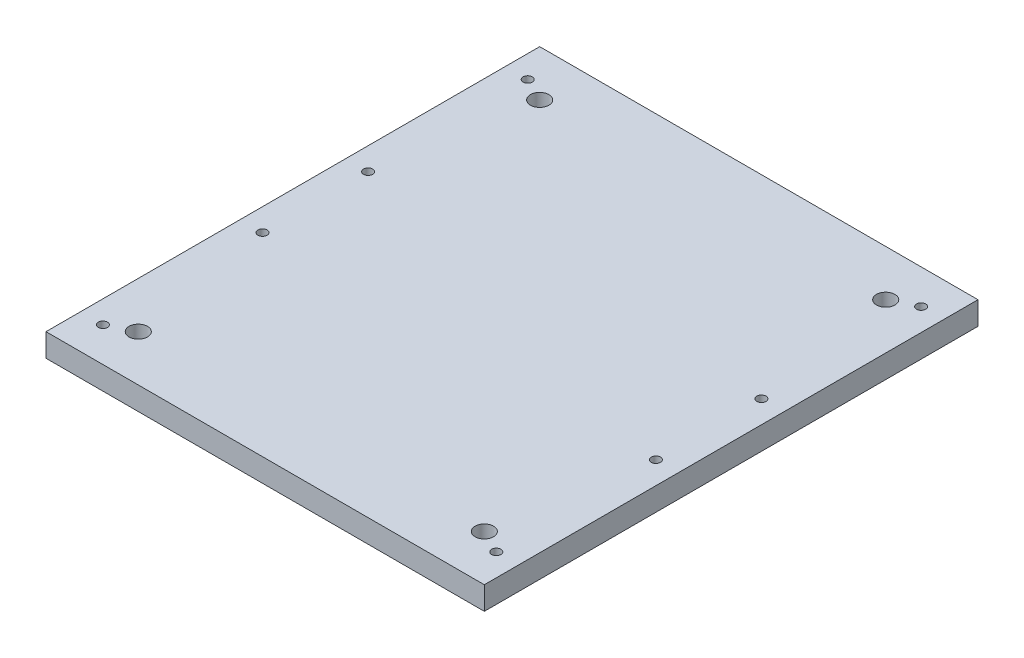
ISO-10303-21;
HEADER;
FILE_DESCRIPTION(('STEP AP214'),'2;1');
FILE_NAME('part.step','',(''),(''),'','','');
FILE_SCHEMA(('AUTOMOTIVE_DESIGN { 1 0 10303 214 1 1 1 1 }'));
ENDSEC;
DATA;
#1=APPLICATION_CONTEXT('core data for automotive mechanical design processes');
#2=APPLICATION_PROTOCOL_DEFINITION('international standard','automotive_design',2000,#1);
#3=PRODUCT_CONTEXT('',#1,'mechanical');
#4=PRODUCT('Part','Part','',(#3));
#5=PRODUCT_RELATED_PRODUCT_CATEGORY('part','',(#4));
#6=PRODUCT_DEFINITION_FORMATION('','',#4);
#7=PRODUCT_DEFINITION_CONTEXT('part definition',#1,'design');
#8=PRODUCT_DEFINITION('design','',#6,#7);
#9=PRODUCT_DEFINITION_SHAPE('','',#8);
#10=(LENGTH_UNIT() NAMED_UNIT(*) SI_UNIT(.MILLI.,.METRE.));
#11=(NAMED_UNIT(*) PLANE_ANGLE_UNIT() SI_UNIT($,.RADIAN.));
#12=(NAMED_UNIT(*) SI_UNIT($,.STERADIAN.) SOLID_ANGLE_UNIT());
#13=UNCERTAINTY_MEASURE_WITH_UNIT(LENGTH_MEASURE(1.E-05),#10,'distance_accuracy_value','');
#14=(GEOMETRIC_REPRESENTATION_CONTEXT(3) GLOBAL_UNCERTAINTY_ASSIGNED_CONTEXT((#13)) GLOBAL_UNIT_ASSIGNED_CONTEXT((#10,
#11,#12)) REPRESENTATION_CONTEXT('',''));
#15=CARTESIAN_POINT('',(0.,0.,0.));
#16=DIRECTION('',(0.,0.,1.));
#17=DIRECTION('',(1.,0.,0.));
#18=AXIS2_PLACEMENT_3D('',#15,#16,#17);
#19=CARTESIAN_POINT('',(0.,5.,53.5));
#20=DIRECTION('',(0.,0.,-1.));
#21=DIRECTION('',(-1.,0.,0.));
#22=AXIS2_PLACEMENT_3D('',#19,#20,#21);
#23=PLANE('',#22);
#24=DIRECTION('',(1.,0.,0.));
#25=VECTOR('',#24,1.);
#26=CARTESIAN_POINT('',(0.,0.,53.5));
#27=LINE('',#26,#25);
#28=CARTESIAN_POINT('',(-47.5,0.,53.5));
#29=VERTEX_POINT('',#28);
#30=CARTESIAN_POINT('',(47.5,0.,53.5));
#31=VERTEX_POINT('',#30);
#32=EDGE_CURVE('E115',#29,#31,#27,.T.);
#33=ORIENTED_EDGE('',*,*,#32,.T.);
#34=DIRECTION('',(0.,-1.,0.));
#35=VECTOR('',#34,1.);
#36=CARTESIAN_POINT('',(47.5,5.,53.5));
#37=LINE('',#36,#35);
#38=CARTESIAN_POINT('',(47.5,5.,53.5));
#39=VERTEX_POINT('',#38);
#40=EDGE_CURVE('E11',#39,#31,#37,.T.);
#41=ORIENTED_EDGE('',*,*,#40,.F.);
#42=DIRECTION('',(1.,0.,0.));
#43=VECTOR('',#42,1.);
#44=CARTESIAN_POINT('',(0.,5.,53.5));
#45=LINE('',#44,#43);
#46=CARTESIAN_POINT('',(-47.5,5.,53.5));
#47=VERTEX_POINT('',#46);
#48=EDGE_CURVE('E89',#47,#39,#45,.T.);
#49=ORIENTED_EDGE('',*,*,#48,.F.);
#50=DIRECTION('',(0.,-1.,0.));
#51=VECTOR('',#50,1.);
#52=CARTESIAN_POINT('',(-47.5,5.,53.5));
#53=LINE('',#52,#51);
#54=EDGE_CURVE('E55',#47,#29,#53,.T.);
#55=ORIENTED_EDGE('',*,*,#54,.T.);
#56=EDGE_LOOP('',(#33,#41,#49,#55));
#57=FACE_BOUND('',#56,.T.);
#58=ADVANCED_FACE('F39',(#57),#23,.F.);
#59=CARTESIAN_POINT('',(47.5,5.,0.));
#60=DIRECTION('',(-1.,0.,0.));
#61=DIRECTION('',(0.,0.,1.));
#62=AXIS2_PLACEMENT_3D('',#59,#60,#61);
#63=PLANE('',#62);
#64=DIRECTION('',(0.,0.,-1.));
#65=VECTOR('',#64,1.);
#66=CARTESIAN_POINT('',(47.5,0.,0.));
#67=LINE('',#66,#65);
#68=CARTESIAN_POINT('',(47.5,0.,-53.5));
#69=VERTEX_POINT('',#68);
#70=EDGE_CURVE('E94',#31,#69,#67,.T.);
#71=ORIENTED_EDGE('',*,*,#70,.T.);
#72=DIRECTION('',(0.,-1.,0.));
#73=VECTOR('',#72,1.);
#74=CARTESIAN_POINT('',(47.5,5.,-53.5));
#75=LINE('',#74,#73);
#76=CARTESIAN_POINT('',(47.5,5.,-53.5));
#77=VERTEX_POINT('',#76);
#78=EDGE_CURVE('E47',#77,#69,#75,.T.);
#79=ORIENTED_EDGE('',*,*,#78,.F.);
#80=DIRECTION('',(0.,0.,-1.));
#81=VECTOR('',#80,1.);
#82=CARTESIAN_POINT('',(47.5,5.,0.));
#83=LINE('',#82,#81);
#84=EDGE_CURVE('E80',#39,#77,#83,.T.);
#85=ORIENTED_EDGE('',*,*,#84,.F.);
#86=ORIENTED_EDGE('',*,*,#40,.T.);
#87=EDGE_LOOP('',(#71,#79,#85,#86));
#88=FACE_BOUND('',#87,.T.);
#89=ADVANCED_FACE('F93',(#88),#63,.F.);
#90=CARTESIAN_POINT('',(0.,5.,-53.5));
#91=DIRECTION('',(0.,0.,-1.));
#92=DIRECTION('',(-1.,0.,0.));
#93=AXIS2_PLACEMENT_3D('',#90,#91,#92);
#94=PLANE('',#93);
#95=DIRECTION('',(1.,0.,0.));
#96=VECTOR('',#95,1.);
#97=CARTESIAN_POINT('',(0.,0.,-53.5));
#98=LINE('',#97,#96);
#99=CARTESIAN_POINT('',(-47.5,0.,-53.5));
#100=VERTEX_POINT('',#99);
#101=EDGE_CURVE('E119',#100,#69,#98,.T.);
#102=ORIENTED_EDGE('',*,*,#101,.F.);
#103=DIRECTION('',(0.,-1.,0.));
#104=VECTOR('',#103,1.);
#105=CARTESIAN_POINT('',(-47.5,5.,-53.5));
#106=LINE('',#105,#104);
#107=CARTESIAN_POINT('',(-47.5,5.,-53.5));
#108=VERTEX_POINT('',#107);
#109=EDGE_CURVE('E69',#108,#100,#106,.T.);
#110=ORIENTED_EDGE('',*,*,#109,.F.);
#111=DIRECTION('',(1.,0.,0.));
#112=VECTOR('',#111,1.);
#113=CARTESIAN_POINT('',(0.,5.,-53.5));
#114=LINE('',#113,#112);
#115=EDGE_CURVE('E88',#108,#77,#114,.T.);
#116=ORIENTED_EDGE('',*,*,#115,.T.);
#117=ORIENTED_EDGE('',*,*,#78,.T.);
#118=EDGE_LOOP('',(#102,#110,#116,#117));
#119=FACE_BOUND('',#118,.T.);
#120=ADVANCED_FACE('F97',(#119),#94,.T.);
#121=CARTESIAN_POINT('',(37.5,5.,43.5));
#122=DIRECTION('',(0.,-1.,0.));
#123=DIRECTION('',(0.,0.,-1.));
#124=AXIS2_PLACEMENT_3D('',#121,#122,#123);
#125=CYLINDRICAL_SURFACE('',#124,2.);
#126=CARTESIAN_POINT('',(37.5,5.,43.5));
#127=DIRECTION('',(0.,1.,0.));
#128=DIRECTION('',(0.,0.,1.));
#129=AXIS2_PLACEMENT_3D('',#126,#127,#128);
#130=CIRCLE('',#129,2.);
#131=CARTESIAN_POINT('',(37.5,5.,45.5));
#132=VERTEX_POINT('',#131);
#133=EDGE_CURVE('E109',#132,#132,#130,.T.);
#134=ORIENTED_EDGE('',*,*,#133,.T.);
#135=EDGE_LOOP('',(#134));
#136=FACE_BOUND('',#135,.T.);
#137=CARTESIAN_POINT('',(37.5,0.,43.5));
#138=DIRECTION('',(0.,1.,0.));
#139=DIRECTION('',(0.,0.,1.));
#140=AXIS2_PLACEMENT_3D('',#137,#138,#139);
#141=CIRCLE('',#140,2.);
#142=CARTESIAN_POINT('',(37.5,0.,45.5));
#143=VERTEX_POINT('',#142);
#144=EDGE_CURVE('E130',#143,#143,#141,.T.);
#145=ORIENTED_EDGE('',*,*,#144,.F.);
#146=EDGE_LOOP('',(#145));
#147=FACE_BOUND('',#146,.T.);
#148=ADVANCED_FACE('F224',(#136,#147),#125,.F.);
#149=CARTESIAN_POINT('',(37.5,5.,-43.5));
#150=DIRECTION('',(0.,-1.,0.));
#151=DIRECTION('',(0.,0.,-1.));
#152=AXIS2_PLACEMENT_3D('',#149,#150,#151);
#153=CYLINDRICAL_SURFACE('',#152,2.);
#154=CARTESIAN_POINT('',(37.5,5.,-43.5));
#155=DIRECTION('',(0.,1.,0.));
#156=DIRECTION('',(0.,0.,1.));
#157=AXIS2_PLACEMENT_3D('',#154,#155,#156);
#158=CIRCLE('',#157,2.);
#159=CARTESIAN_POINT('',(37.5,5.,-41.5));
#160=VERTEX_POINT('',#159);
#161=EDGE_CURVE('E106',#160,#160,#158,.F.);
#162=ORIENTED_EDGE('',*,*,#161,.F.);
#163=EDGE_LOOP('',(#162));
#164=FACE_BOUND('',#163,.T.);
#165=CARTESIAN_POINT('',(37.5,0.,-43.5));
#166=DIRECTION('',(0.,1.,0.));
#167=DIRECTION('',(0.,0.,1.));
#168=AXIS2_PLACEMENT_3D('',#165,#166,#167);
#169=CIRCLE('',#168,2.);
#170=CARTESIAN_POINT('',(37.5,0.,-41.5));
#171=VERTEX_POINT('',#170);
#172=EDGE_CURVE('E127',#171,#171,#169,.F.);
#173=ORIENTED_EDGE('',*,*,#172,.T.);
#174=EDGE_LOOP('',(#173));
#175=FACE_BOUND('',#174,.T.);
#176=ADVANCED_FACE('F226',(#164,#175),#153,.F.);
#177=CARTESIAN_POINT('',(-37.5,5.,-43.5));
#178=DIRECTION('',(0.,-1.,0.));
#179=DIRECTION('',(0.,0.,-1.));
#180=AXIS2_PLACEMENT_3D('',#177,#178,#179);
#181=CYLINDRICAL_SURFACE('',#180,2.);
#182=CARTESIAN_POINT('',(-37.5,5.,-43.5));
#183=DIRECTION('',(0.,1.,0.));
#184=DIRECTION('',(0.,0.,1.));
#185=AXIS2_PLACEMENT_3D('',#182,#183,#184);
#186=CIRCLE('',#185,2.);
#187=CARTESIAN_POINT('',(-37.5,5.,-41.5));
#188=VERTEX_POINT('',#187);
#189=EDGE_CURVE('E100',#188,#188,#186,.T.);
#190=ORIENTED_EDGE('',*,*,#189,.T.);
#191=EDGE_LOOP('',(#190));
#192=FACE_BOUND('',#191,.T.);
#193=CARTESIAN_POINT('',(-37.5,0.,-43.5));
#194=DIRECTION('',(0.,1.,0.));
#195=DIRECTION('',(0.,0.,1.));
#196=AXIS2_PLACEMENT_3D('',#193,#194,#195);
#197=CIRCLE('',#196,2.);
#198=CARTESIAN_POINT('',(-37.5,0.,-41.5));
#199=VERTEX_POINT('',#198);
#200=EDGE_CURVE('E124',#199,#199,#197,.T.);
#201=ORIENTED_EDGE('',*,*,#200,.F.);
#202=EDGE_LOOP('',(#201));
#203=FACE_BOUND('',#202,.T.);
#204=ADVANCED_FACE('F233',(#192,#203),#181,.F.);
#205=CARTESIAN_POINT('',(-47.5,5.,0.));
#206=DIRECTION('',(-1.,0.,0.));
#207=DIRECTION('',(0.,0.,1.));
#208=AXIS2_PLACEMENT_3D('',#205,#206,#207);
#209=PLANE('',#208);
#210=DIRECTION('',(0.,0.,-1.));
#211=VECTOR('',#210,1.);
#212=CARTESIAN_POINT('',(-47.5,0.,0.));
#213=LINE('',#212,#211);
#214=EDGE_CURVE('E121',#29,#100,#213,.T.);
#215=ORIENTED_EDGE('',*,*,#214,.F.);
#216=ORIENTED_EDGE('',*,*,#54,.F.);
#217=DIRECTION('',(0.,0.,-1.));
#218=VECTOR('',#217,1.);
#219=CARTESIAN_POINT('',(-47.5,5.,0.));
#220=LINE('',#219,#218);
#221=EDGE_CURVE('E98',#47,#108,#220,.T.);
#222=ORIENTED_EDGE('',*,*,#221,.T.);
#223=ORIENTED_EDGE('',*,*,#109,.T.);
#224=EDGE_LOOP('',(#215,#216,#222,#223));
#225=FACE_BOUND('',#224,.T.);
#226=ADVANCED_FACE('F242',(#225),#209,.T.);
#227=CARTESIAN_POINT('',(-37.5,5.,43.5));
#228=DIRECTION('',(0.,-1.,0.));
#229=DIRECTION('',(0.,0.,-1.));
#230=AXIS2_PLACEMENT_3D('',#227,#228,#229);
#231=CYLINDRICAL_SURFACE('',#230,2.);
#232=CARTESIAN_POINT('',(-37.5,5.,43.5));
#233=DIRECTION('',(0.,1.,0.));
#234=DIRECTION('',(0.,0.,1.));
#235=AXIS2_PLACEMENT_3D('',#232,#233,#234);
#236=CIRCLE('',#235,2.);
#237=CARTESIAN_POINT('',(-37.5,5.,45.5));
#238=VERTEX_POINT('',#237);
#239=EDGE_CURVE('E112',#238,#238,#236,.F.);
#240=ORIENTED_EDGE('',*,*,#239,.F.);
#241=EDGE_LOOP('',(#240));
#242=FACE_BOUND('',#241,.T.);
#243=CARTESIAN_POINT('',(-37.5,0.,43.5));
#244=DIRECTION('',(0.,1.,0.));
#245=DIRECTION('',(0.,0.,1.));
#246=AXIS2_PLACEMENT_3D('',#243,#244,#245);
#247=CIRCLE('',#246,2.);
#248=CARTESIAN_POINT('',(-37.5,0.,45.5));
#249=VERTEX_POINT('',#248);
#250=EDGE_CURVE('E133',#249,#249,#247,.F.);
#251=ORIENTED_EDGE('',*,*,#250,.T.);
#252=EDGE_LOOP('',(#251));
#253=FACE_BOUND('',#252,.T.);
#254=ADVANCED_FACE('F244',(#242,#253),#231,.F.);
#255=CARTESIAN_POINT('',(0.,5.,0.));
#256=DIRECTION('',(0.,1.,0.));
#257=DIRECTION('',(0.,0.,1.));
#258=AXIS2_PLACEMENT_3D('',#255,#256,#257);
#259=PLANE('',#258);
#260=CARTESIAN_POINT('',(-42.63,5.,11.4372225515875));
#261=DIRECTION('',(0.,-1.,0.));
#262=DIRECTION('',(0.,0.,1.));
#263=AXIS2_PLACEMENT_3D('',#260,#261,#262);
#264=CIRCLE('',#263,0.999999999999998);
#265=CARTESIAN_POINT('',(-42.63,5.,12.4372225515875));
#266=VERTEX_POINT('',#265);
#267=EDGE_CURVE('E181',#266,#266,#264,.T.);
#268=ORIENTED_EDGE('',*,*,#267,.T.);
#269=EDGE_LOOP('',(#268));
#270=FACE_BOUND('',#269,.T.);
#271=CARTESIAN_POINT('',(-42.63,5.,-11.4372225515875));
#272=DIRECTION('',(0.,1.,0.));
#273=DIRECTION('',(0.,0.,-1.));
#274=AXIS2_PLACEMENT_3D('',#271,#272,#273);
#275=CIRCLE('',#274,0.999999999999998);
#276=CARTESIAN_POINT('',(-42.63,5.,-12.4372225515875));
#277=VERTEX_POINT('',#276);
#278=EDGE_CURVE('E178',#277,#277,#275,.T.);
#279=ORIENTED_EDGE('',*,*,#278,.F.);
#280=EDGE_LOOP('',(#279));
#281=FACE_BOUND('',#280,.T.);
#282=CARTESIAN_POINT('',(42.63,5.,11.4372225515875));
#283=DIRECTION('',(0.,1.,0.));
#284=DIRECTION('',(0.,0.,1.));
#285=AXIS2_PLACEMENT_3D('',#282,#283,#284);
#286=CIRCLE('',#285,0.999999999999998);
#287=CARTESIAN_POINT('',(42.63,5.,12.4372225515875));
#288=VERTEX_POINT('',#287);
#289=EDGE_CURVE('E172',#288,#288,#286,.T.);
#290=ORIENTED_EDGE('',*,*,#289,.F.);
#291=EDGE_LOOP('',(#290));
#292=FACE_BOUND('',#291,.T.);
#293=CARTESIAN_POINT('',(-42.63,5.,46.04));
#294=DIRECTION('',(0.,1.,0.));
#295=DIRECTION('',(0.,0.,-1.));
#296=AXIS2_PLACEMENT_3D('',#293,#294,#295);
#297=CIRCLE('',#296,0.999999999999998);
#298=CARTESIAN_POINT('',(-42.63,5.,45.04));
#299=VERTEX_POINT('',#298);
#300=EDGE_CURVE('E166',#299,#299,#297,.T.);
#301=ORIENTED_EDGE('',*,*,#300,.F.);
#302=EDGE_LOOP('',(#301));
#303=FACE_BOUND('',#302,.T.);
#304=CARTESIAN_POINT('',(-42.63,5.,-46.04));
#305=DIRECTION('',(0.,-1.,0.));
#306=DIRECTION('',(0.,0.,1.));
#307=AXIS2_PLACEMENT_3D('',#304,#305,#306);
#308=CIRCLE('',#307,0.999999999999998);
#309=CARTESIAN_POINT('',(-42.63,5.,-45.04));
#310=VERTEX_POINT('',#309);
#311=EDGE_CURVE('E155',#310,#310,#308,.T.);
#312=ORIENTED_EDGE('',*,*,#311,.T.);
#313=EDGE_LOOP('',(#312));
#314=FACE_BOUND('',#313,.T.);
#315=CARTESIAN_POINT('',(42.63,5.,46.04));
#316=DIRECTION('',(0.,-1.,0.));
#317=DIRECTION('',(0.,0.,-1.));
#318=AXIS2_PLACEMENT_3D('',#315,#316,#317);
#319=CIRCLE('',#318,0.999999999999998);
#320=CARTESIAN_POINT('',(42.63,5.,45.04));
#321=VERTEX_POINT('',#320);
#322=EDGE_CURVE('E149',#321,#321,#319,.T.);
#323=ORIENTED_EDGE('',*,*,#322,.T.);
#324=EDGE_LOOP('',(#323));
#325=FACE_BOUND('',#324,.T.);
#326=CARTESIAN_POINT('',(42.63,5.,-11.4372225515875));
#327=DIRECTION('',(0.,-1.,0.));
#328=DIRECTION('',(0.,0.,-1.));
#329=AXIS2_PLACEMENT_3D('',#326,#327,#328);
#330=CIRCLE('',#329,0.999999999999998);
#331=CARTESIAN_POINT('',(42.63,5.,-12.4372225515875));
#332=VERTEX_POINT('',#331);
#333=EDGE_CURVE('E145',#332,#332,#330,.T.);
#334=ORIENTED_EDGE('',*,*,#333,.T.);
#335=EDGE_LOOP('',(#334));
#336=FACE_BOUND('',#335,.T.);
#337=CARTESIAN_POINT('',(42.63,5.,-46.04));
#338=DIRECTION('',(0.,1.,0.));
#339=DIRECTION('',(0.,0.,1.));
#340=AXIS2_PLACEMENT_3D('',#337,#338,#339);
#341=CIRCLE('',#340,0.999999999999998);
#342=CARTESIAN_POINT('',(42.63,5.,-45.04));
#343=VERTEX_POINT('',#342);
#344=EDGE_CURVE('E142',#343,#343,#341,.T.);
#345=ORIENTED_EDGE('',*,*,#344,.F.);
#346=EDGE_LOOP('',(#345));
#347=FACE_BOUND('',#346,.T.);
#348=ORIENTED_EDGE('',*,*,#48,.T.);
#349=ORIENTED_EDGE('',*,*,#84,.T.);
#350=ORIENTED_EDGE('',*,*,#115,.F.);
#351=ORIENTED_EDGE('',*,*,#221,.F.);
#352=EDGE_LOOP('',(#348,#349,#350,#351));
#353=FACE_BOUND('',#352,.T.);
#354=ORIENTED_EDGE('',*,*,#189,.F.);
#355=EDGE_LOOP('',(#354));
#356=FACE_BOUND('',#355,.T.);
#357=ORIENTED_EDGE('',*,*,#161,.T.);
#358=EDGE_LOOP('',(#357));
#359=FACE_BOUND('',#358,.T.);
#360=ORIENTED_EDGE('',*,*,#133,.F.);
#361=EDGE_LOOP('',(#360));
#362=FACE_BOUND('',#361,.T.);
#363=ORIENTED_EDGE('',*,*,#239,.T.);
#364=EDGE_LOOP('',(#363));
#365=FACE_BOUND('',#364,.T.);
#366=ADVANCED_FACE('F84',(#270,#281,#292,#303,#314,#325,#336,#347,#353,#356,#359,#362,#365),
#259,.T.);
#367=CARTESIAN_POINT('',(0.,0.,0.));
#368=DIRECTION('',(0.,1.,0.));
#369=DIRECTION('',(0.,0.,1.));
#370=AXIS2_PLACEMENT_3D('',#367,#368,#369);
#371=PLANE('',#370);
#372=CARTESIAN_POINT('',(-42.63,0.,11.4372225515875));
#373=DIRECTION('',(0.,1.,0.));
#374=DIRECTION('',(0.,0.,1.));
#375=AXIS2_PLACEMENT_3D('',#372,#373,#374);
#376=CIRCLE('',#375,0.999999999999998);
#377=CARTESIAN_POINT('',(-42.63,0.,12.4372225515875));
#378=VERTEX_POINT('',#377);
#379=EDGE_CURVE('E182',#378,#378,#376,.T.);
#380=ORIENTED_EDGE('',*,*,#379,.T.);
#381=EDGE_LOOP('',(#380));
#382=FACE_BOUND('',#381,.T.);
#383=CARTESIAN_POINT('',(-42.63,0.,-11.4372225515875));
#384=DIRECTION('',(0.,1.,0.));
#385=DIRECTION('',(0.,0.,1.));
#386=AXIS2_PLACEMENT_3D('',#383,#384,#385);
#387=CIRCLE('',#386,0.999999999999998);
#388=CARTESIAN_POINT('',(-42.63,0.,-10.4372225515875));
#389=VERTEX_POINT('',#388);
#390=EDGE_CURVE('E175',#389,#389,#387,.F.);
#391=ORIENTED_EDGE('',*,*,#390,.F.);
#392=EDGE_LOOP('',(#391));
#393=FACE_BOUND('',#392,.T.);
#394=CARTESIAN_POINT('',(42.63,0.,11.4372225515875));
#395=DIRECTION('',(0.,1.,0.));
#396=DIRECTION('',(0.,0.,1.));
#397=AXIS2_PLACEMENT_3D('',#394,#395,#396);
#398=CIRCLE('',#397,0.999999999999998);
#399=CARTESIAN_POINT('',(42.63,0.,12.4372225515875));
#400=VERTEX_POINT('',#399);
#401=EDGE_CURVE('E169',#400,#400,#398,.F.);
#402=ORIENTED_EDGE('',*,*,#401,.F.);
#403=EDGE_LOOP('',(#402));
#404=FACE_BOUND('',#403,.T.);
#405=CARTESIAN_POINT('',(-42.63,0.,46.04));
#406=DIRECTION('',(0.,1.,0.));
#407=DIRECTION('',(0.,0.,1.));
#408=AXIS2_PLACEMENT_3D('',#405,#406,#407);
#409=CIRCLE('',#408,0.999999999999998);
#410=CARTESIAN_POINT('',(-42.63,0.,47.04));
#411=VERTEX_POINT('',#410);
#412=EDGE_CURVE('E161',#411,#411,#409,.F.);
#413=ORIENTED_EDGE('',*,*,#412,.F.);
#414=EDGE_LOOP('',(#413));
#415=FACE_BOUND('',#414,.T.);
#416=CARTESIAN_POINT('',(-42.63,0.,-46.04));
#417=DIRECTION('',(0.,1.,0.));
#418=DIRECTION('',(0.,0.,1.));
#419=AXIS2_PLACEMENT_3D('',#416,#417,#418);
#420=CIRCLE('',#419,0.999999999999998);
#421=CARTESIAN_POINT('',(-42.63,0.,-45.04));
#422=VERTEX_POINT('',#421);
#423=EDGE_CURVE('E158',#422,#422,#420,.T.);
#424=ORIENTED_EDGE('',*,*,#423,.T.);
#425=EDGE_LOOP('',(#424));
#426=FACE_BOUND('',#425,.T.);
#427=CARTESIAN_POINT('',(42.63,0.,46.04));
#428=DIRECTION('',(0.,1.,0.));
#429=DIRECTION('',(0.,0.,1.));
#430=AXIS2_PLACEMENT_3D('',#427,#428,#429);
#431=CIRCLE('',#430,0.999999999999998);
#432=CARTESIAN_POINT('',(42.63,0.,47.04));
#433=VERTEX_POINT('',#432);
#434=EDGE_CURVE('E152',#433,#433,#431,.T.);
#435=ORIENTED_EDGE('',*,*,#434,.T.);
#436=EDGE_LOOP('',(#435));
#437=FACE_BOUND('',#436,.T.);
#438=CARTESIAN_POINT('',(42.63,0.,-11.4372225515875));
#439=DIRECTION('',(0.,1.,0.));
#440=DIRECTION('',(0.,0.,1.));
#441=AXIS2_PLACEMENT_3D('',#438,#439,#440);
#442=CIRCLE('',#441,0.999999999999998);
#443=CARTESIAN_POINT('',(42.63,0.,-10.4372225515875));
#444=VERTEX_POINT('',#443);
#445=EDGE_CURVE('E146',#444,#444,#442,.T.);
#446=ORIENTED_EDGE('',*,*,#445,.T.);
#447=EDGE_LOOP('',(#446));
#448=FACE_BOUND('',#447,.T.);
#449=CARTESIAN_POINT('',(42.63,0.,-46.04));
#450=DIRECTION('',(0.,1.,0.));
#451=DIRECTION('',(0.,0.,1.));
#452=AXIS2_PLACEMENT_3D('',#449,#450,#451);
#453=CIRCLE('',#452,0.999999999999998);
#454=CARTESIAN_POINT('',(42.63,0.,-45.04));
#455=VERTEX_POINT('',#454);
#456=EDGE_CURVE('E117',#455,#455,#453,.F.);
#457=ORIENTED_EDGE('',*,*,#456,.F.);
#458=EDGE_LOOP('',(#457));
#459=FACE_BOUND('',#458,.T.);
#460=ORIENTED_EDGE('',*,*,#32,.F.);
#461=ORIENTED_EDGE('',*,*,#214,.T.);
#462=ORIENTED_EDGE('',*,*,#101,.T.);
#463=ORIENTED_EDGE('',*,*,#70,.F.);
#464=EDGE_LOOP('',(#460,#461,#462,#463));
#465=FACE_BOUND('',#464,.T.);
#466=ORIENTED_EDGE('',*,*,#200,.T.);
#467=EDGE_LOOP('',(#466));
#468=FACE_BOUND('',#467,.T.);
#469=ORIENTED_EDGE('',*,*,#172,.F.);
#470=EDGE_LOOP('',(#469));
#471=FACE_BOUND('',#470,.T.);
#472=ORIENTED_EDGE('',*,*,#144,.T.);
#473=EDGE_LOOP('',(#472));
#474=FACE_BOUND('',#473,.T.);
#475=ORIENTED_EDGE('',*,*,#250,.F.);
#476=EDGE_LOOP('',(#475));
#477=FACE_BOUND('',#476,.T.);
#478=ADVANCED_FACE('F197',(#382,#393,#404,#415,#426,#437,#448,#459,#465,#468,#471,#474,#477),
#371,.F.);
#479=CARTESIAN_POINT('',(42.63,-0.00100000000000013,-46.04));
#480=DIRECTION('',(0.,1.,0.));
#481=DIRECTION('',(0.,0.,1.));
#482=AXIS2_PLACEMENT_3D('',#479,#480,#481);
#483=CYLINDRICAL_SURFACE('',#482,0.999999999999998);
#484=ORIENTED_EDGE('',*,*,#344,.T.);
#485=EDGE_LOOP('',(#484));
#486=FACE_BOUND('',#485,.T.);
#487=ORIENTED_EDGE('',*,*,#456,.T.);
#488=EDGE_LOOP('',(#487));
#489=FACE_BOUND('',#488,.T.);
#490=ADVANCED_FACE('F200',(#486,#489),#483,.F.);
#491=CARTESIAN_POINT('',(42.63,-0.00100000000000013,-11.4372225515875));
#492=DIRECTION('',(0.,1.,0.));
#493=DIRECTION('',(0.,0.,1.));
#494=AXIS2_PLACEMENT_3D('',#491,#492,#493);
#495=CYLINDRICAL_SURFACE('',#494,0.999999999999998);
#496=ORIENTED_EDGE('',*,*,#333,.F.);
#497=EDGE_LOOP('',(#496));
#498=FACE_BOUND('',#497,.T.);
#499=ORIENTED_EDGE('',*,*,#445,.F.);
#500=EDGE_LOOP('',(#499));
#501=FACE_BOUND('',#500,.T.);
#502=ADVANCED_FACE('F271',(#498,#501),#495,.F.);
#503=CARTESIAN_POINT('',(42.63,-0.00100000000000013,46.04));
#504=DIRECTION('',(0.,1.,0.));
#505=DIRECTION('',(0.,0.,1.));
#506=AXIS2_PLACEMENT_3D('',#503,#504,#505);
#507=CYLINDRICAL_SURFACE('',#506,0.999999999999998);
#508=ORIENTED_EDGE('',*,*,#322,.F.);
#509=EDGE_LOOP('',(#508));
#510=FACE_BOUND('',#509,.T.);
#511=ORIENTED_EDGE('',*,*,#434,.F.);
#512=EDGE_LOOP('',(#511));
#513=FACE_BOUND('',#512,.T.);
#514=ADVANCED_FACE('F275',(#510,#513),#507,.F.);
#515=CARTESIAN_POINT('',(-42.63,-0.00100000000000013,-46.04));
#516=DIRECTION('',(0.,1.,0.));
#517=DIRECTION('',(0.,0.,1.));
#518=AXIS2_PLACEMENT_3D('',#515,#516,#517);
#519=CYLINDRICAL_SURFACE('',#518,0.999999999999998);
#520=ORIENTED_EDGE('',*,*,#311,.F.);
#521=EDGE_LOOP('',(#520));
#522=FACE_BOUND('',#521,.T.);
#523=ORIENTED_EDGE('',*,*,#423,.F.);
#524=EDGE_LOOP('',(#523));
#525=FACE_BOUND('',#524,.T.);
#526=ADVANCED_FACE('F279',(#522,#525),#519,.F.);
#527=CARTESIAN_POINT('',(-42.63,-0.00100000000000013,46.04));
#528=DIRECTION('',(0.,1.,0.));
#529=DIRECTION('',(0.,0.,1.));
#530=AXIS2_PLACEMENT_3D('',#527,#528,#529);
#531=CYLINDRICAL_SURFACE('',#530,0.999999999999998);
#532=ORIENTED_EDGE('',*,*,#300,.T.);
#533=EDGE_LOOP('',(#532));
#534=FACE_BOUND('',#533,.T.);
#535=ORIENTED_EDGE('',*,*,#412,.T.);
#536=EDGE_LOOP('',(#535));
#537=FACE_BOUND('',#536,.T.);
#538=ADVANCED_FACE('F283',(#534,#537),#531,.F.);
#539=CARTESIAN_POINT('',(42.63,-0.00100000000000013,11.4372225515875));
#540=DIRECTION('',(0.,1.,0.));
#541=DIRECTION('',(0.,0.,1.));
#542=AXIS2_PLACEMENT_3D('',#539,#540,#541);
#543=CYLINDRICAL_SURFACE('',#542,0.999999999999998);
#544=ORIENTED_EDGE('',*,*,#289,.T.);
#545=EDGE_LOOP('',(#544));
#546=FACE_BOUND('',#545,.T.);
#547=ORIENTED_EDGE('',*,*,#401,.T.);
#548=EDGE_LOOP('',(#547));
#549=FACE_BOUND('',#548,.T.);
#550=ADVANCED_FACE('F287',(#546,#549),#543,.F.);
#551=CARTESIAN_POINT('',(-42.63,-0.00100000000000013,-11.4372225515875));
#552=DIRECTION('',(0.,1.,0.));
#553=DIRECTION('',(0.,0.,1.));
#554=AXIS2_PLACEMENT_3D('',#551,#552,#553);
#555=CYLINDRICAL_SURFACE('',#554,0.999999999999998);
#556=ORIENTED_EDGE('',*,*,#278,.T.);
#557=EDGE_LOOP('',(#556));
#558=FACE_BOUND('',#557,.T.);
#559=ORIENTED_EDGE('',*,*,#390,.T.);
#560=EDGE_LOOP('',(#559));
#561=FACE_BOUND('',#560,.T.);
#562=ADVANCED_FACE('F193',(#558,#561),#555,.F.);
#563=CARTESIAN_POINT('',(-42.63,-0.00100000000000013,11.4372225515875));
#564=DIRECTION('',(0.,1.,0.));
#565=DIRECTION('',(0.,0.,1.));
#566=AXIS2_PLACEMENT_3D('',#563,#564,#565);
#567=CYLINDRICAL_SURFACE('',#566,0.999999999999998);
#568=ORIENTED_EDGE('',*,*,#267,.F.);
#569=EDGE_LOOP('',(#568));
#570=FACE_BOUND('',#569,.T.);
#571=ORIENTED_EDGE('',*,*,#379,.F.);
#572=EDGE_LOOP('',(#571));
#573=FACE_BOUND('',#572,.T.);
#574=ADVANCED_FACE('F190',(#570,#573),#567,.F.);
#575=CLOSED_SHELL('',(#58,#89,#120,#148,#176,#204,#226,#254,#366,#478,#490,#502,#514,#526,#538,
#550,#562,#574));
#576=MANIFOLD_SOLID_BREP('B2',#575);
#577=ADVANCED_BREP_SHAPE_REPRESENTATION('',(#18,#576),#14);
#578=SHAPE_DEFINITION_REPRESENTATION(#9,#577);
ENDSEC;
END-ISO-10303-21;
